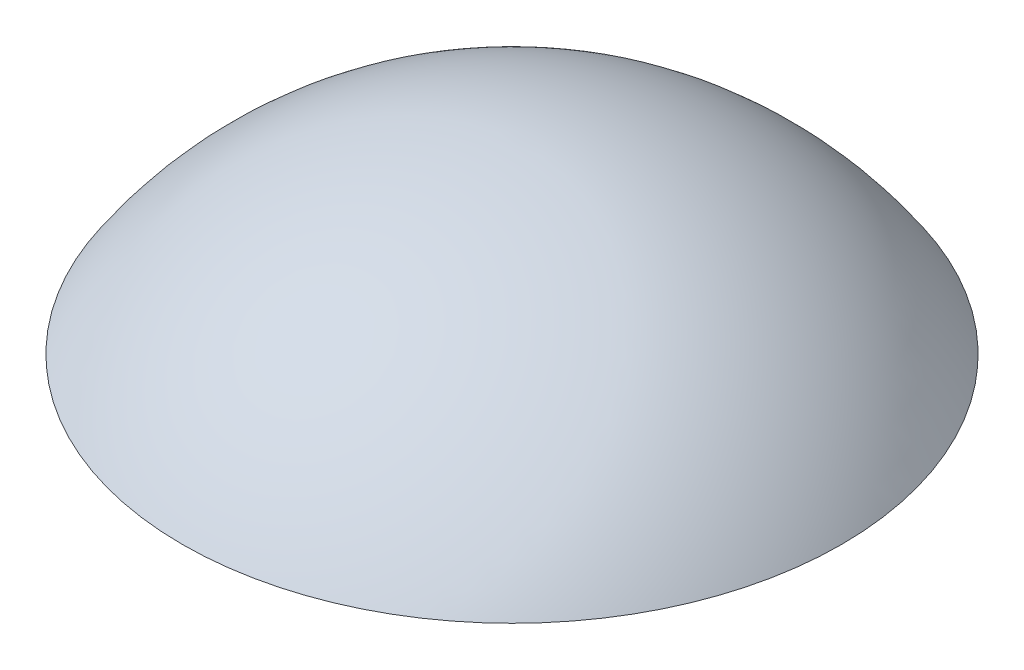
ISO-10303-21;
HEADER;
FILE_DESCRIPTION(('STEP AP214'),'2;1');
FILE_NAME('part.step','',(''),(''),'','','');
FILE_SCHEMA(('AUTOMOTIVE_DESIGN { 1 0 10303 214 1 1 1 1 }'));
ENDSEC;
DATA;
#1=APPLICATION_CONTEXT('core data for automotive mechanical design processes');
#2=APPLICATION_PROTOCOL_DEFINITION('international standard','automotive_design',2000,#1);
#3=PRODUCT_CONTEXT('',#1,'mechanical');
#4=PRODUCT('Part','Part','',(#3));
#5=PRODUCT_RELATED_PRODUCT_CATEGORY('part','',(#4));
#6=PRODUCT_DEFINITION_FORMATION('','',#4);
#7=PRODUCT_DEFINITION_CONTEXT('part definition',#1,'design');
#8=PRODUCT_DEFINITION('design','',#6,#7);
#9=PRODUCT_DEFINITION_SHAPE('','',#8);
#10=(LENGTH_UNIT() NAMED_UNIT(*) SI_UNIT(.MILLI.,.METRE.));
#11=(NAMED_UNIT(*) PLANE_ANGLE_UNIT() SI_UNIT($,.RADIAN.));
#12=(NAMED_UNIT(*) SI_UNIT($,.STERADIAN.) SOLID_ANGLE_UNIT());
#13=UNCERTAINTY_MEASURE_WITH_UNIT(LENGTH_MEASURE(1.E-05),#10,'distance_accuracy_value','');
#14=(GEOMETRIC_REPRESENTATION_CONTEXT(3) GLOBAL_UNCERTAINTY_ASSIGNED_CONTEXT((#13)) GLOBAL_UNIT_ASSIGNED_CONTEXT((#10,
#11,#12)) REPRESENTATION_CONTEXT('',''));
#15=CARTESIAN_POINT('',(0.,0.,0.));
#16=DIRECTION('',(0.,0.,1.));
#17=DIRECTION('',(1.,0.,0.));
#18=AXIS2_PLACEMENT_3D('',#15,#16,#17);
#19=CARTESIAN_POINT('',(0.,0.58,0.));
#20=DIRECTION('',(0.,1.,0.));
#21=DIRECTION('',(1.,0.,0.));
#22=AXIS2_PLACEMENT_3D('',#19,#20,#21);
#23=SPHERICAL_SURFACE('',#22,6.7);
#24=CARTESIAN_POINT('',(0.,4.33606060606061,0.));
#25=DIRECTION('',(0.,1.,0.));
#26=DIRECTION('',(0.,0.,1.));
#27=AXIS2_PLACEMENT_3D('',#24,#25,#26);
#28=CIRCLE('',#27,5.54815363193916);
#29=CARTESIAN_POINT('',(0.,4.33606060606061,5.54815363193916));
#30=VERTEX_POINT('',#29);
#31=EDGE_CURVE('E10',#30,#30,#28,.T.);
#32=ORIENTED_EDGE('',*,*,#31,.F.);
#33=EDGE_LOOP('',(#32));
#34=FACE_BOUND('',#33,.T.);
#35=ADVANCED_FACE('F33',(#34),#23,.F.);
#36=CARTESIAN_POINT('',(5.54815363193916,4.33606060606061,0.));
#37=CARTESIAN_POINT('',(5.40298248991348,5.04493347683729,0.));
#38=CARTESIAN_POINT('',(6.05134321620451,4.92625791000506,0.));
#39=CARTESIAN_POINT('',(6.52085883914075,4.28,0.));
#40=B_SPLINE_CURVE_WITH_KNOTS('',3,(#36,#37,#38,#39),.UNSPECIFIED.,.F.,.F.,(4,4),(0.,1.),.UNSPECIFIED.);
#41=CARTESIAN_POINT('',(0.,60.244207804498,0.));
#42=DIRECTION('',(0.,1.,0.));
#43=AXIS1_PLACEMENT('',#41,#42);
#44=SURFACE_OF_REVOLUTION('',#40,#43);
#45=CARTESIAN_POINT('',(0.,4.28,0.));
#46=DIRECTION('',(0.,1.,0.));
#47=DIRECTION('',(0.,0.,1.));
#48=AXIS2_PLACEMENT_3D('',#45,#46,#47);
#49=CIRCLE('',#48,6.52085883914075);
#50=CARTESIAN_POINT('',(0.,4.28,6.52085883914075));
#51=VERTEX_POINT('',#50);
#52=EDGE_CURVE('E39',#51,#51,#49,.T.);
#53=ORIENTED_EDGE('',*,*,#52,.F.);
#54=EDGE_LOOP('',(#53));
#55=FACE_BOUND('',#54,.T.);
#56=ORIENTED_EDGE('',*,*,#31,.T.);
#57=EDGE_LOOP('',(#56));
#58=FACE_BOUND('',#57,.T.);
#59=ADVANCED_FACE('F52',(#55,#58),#44,.T.);
#60=CARTESIAN_POINT('',(0.,0.,0.));
#61=DIRECTION('',(0.,1.,0.));
#62=DIRECTION('',(1.,0.,0.));
#63=AXIS2_PLACEMENT_3D('',#60,#61,#62);
#64=SPHERICAL_SURFACE('',#63,7.8);
#65=ORIENTED_EDGE('',*,*,#52,.T.);
#66=EDGE_LOOP('',(#65));
#67=FACE_BOUND('',#66,.T.);
#68=ADVANCED_FACE('F55',(#67),#64,.T.);
#69=CLOSED_SHELL('',(#35,#59,#68));
#70=MANIFOLD_SOLID_BREP('B2',#69);
#71=ADVANCED_BREP_SHAPE_REPRESENTATION('',(#18,#70),#14);
#72=SHAPE_DEFINITION_REPRESENTATION(#9,#71);
ENDSEC;
END-ISO-10303-21;
